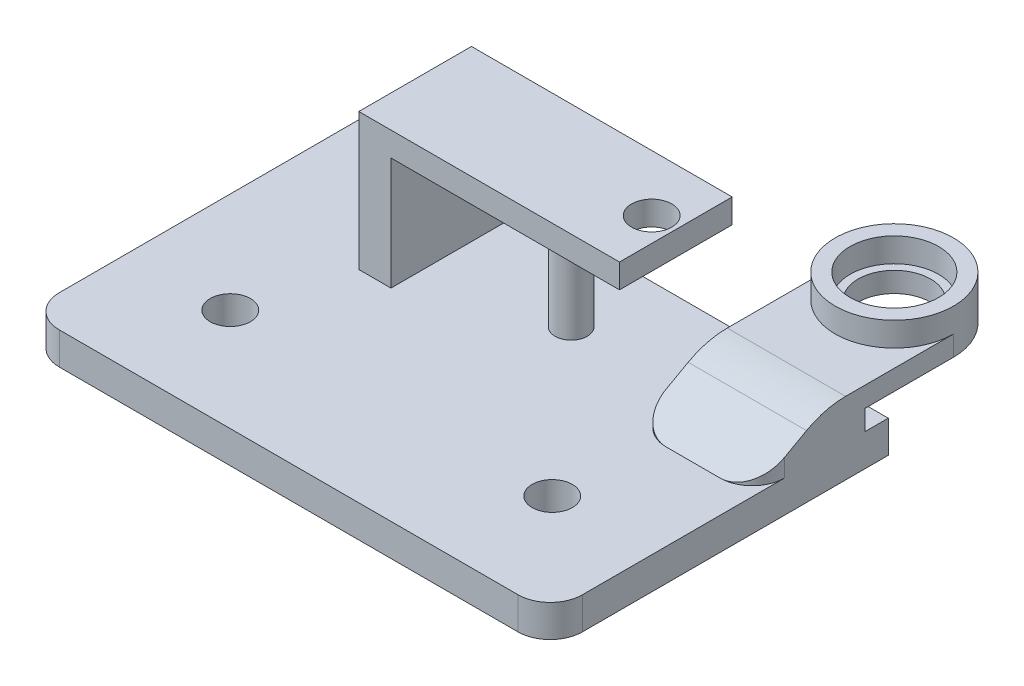
ISO-10303-21;
HEADER;
FILE_DESCRIPTION(('STEP AP214'),'2;1');
FILE_NAME('part.step','',(''),(''),'','','');
FILE_SCHEMA(('AUTOMOTIVE_DESIGN { 1 0 10303 214 1 1 1 1 }'));
ENDSEC;
DATA;
#1=APPLICATION_CONTEXT('core data for automotive mechanical design processes');
#2=APPLICATION_PROTOCOL_DEFINITION('international standard','automotive_design',2000,#1);
#3=PRODUCT_CONTEXT('',#1,'mechanical');
#4=PRODUCT('Part','Part','',(#3));
#5=PRODUCT_RELATED_PRODUCT_CATEGORY('part','',(#4));
#6=PRODUCT_DEFINITION_FORMATION('','',#4);
#7=PRODUCT_DEFINITION_CONTEXT('part definition',#1,'design');
#8=PRODUCT_DEFINITION('design','',#6,#7);
#9=PRODUCT_DEFINITION_SHAPE('','',#8);
#10=(LENGTH_UNIT() NAMED_UNIT(*) SI_UNIT(.MILLI.,.METRE.));
#11=(NAMED_UNIT(*) PLANE_ANGLE_UNIT() SI_UNIT($,.RADIAN.));
#12=(NAMED_UNIT(*) SI_UNIT($,.STERADIAN.) SOLID_ANGLE_UNIT());
#13=UNCERTAINTY_MEASURE_WITH_UNIT(LENGTH_MEASURE(1.E-05),#10,'distance_accuracy_value','');
#14=(GEOMETRIC_REPRESENTATION_CONTEXT(3) GLOBAL_UNCERTAINTY_ASSIGNED_CONTEXT((#13)) GLOBAL_UNIT_ASSIGNED_CONTEXT((#10,
#11,#12)) REPRESENTATION_CONTEXT('',''));
#15=CARTESIAN_POINT('',(0.,0.,0.));
#16=DIRECTION('',(0.,0.,1.));
#17=DIRECTION('',(1.,0.,0.));
#18=AXIS2_PLACEMENT_3D('',#15,#16,#17);
#19=CARTESIAN_POINT('',(45.4999999999992,9.,-32.1043329903239));
#20=DIRECTION('',(0.,1.,0.));
#21=DIRECTION('',(0.,0.,1.));
#22=AXIS2_PLACEMENT_3D('',#19,#20,#21);
#23=PLANE('',#22);
#24=CARTESIAN_POINT('',(57.6499999999992,9.,-50.1043329903239));
#25=DIRECTION('',(0.,1.,0.));
#26=DIRECTION('',(0.,0.,1.));
#27=AXIS2_PLACEMENT_3D('',#24,#25,#26);
#28=CIRCLE('',#27,4.5);
#29=CARTESIAN_POINT('',(57.6499999999992,9.,-45.6043329903239));
#30=VERTEX_POINT('',#29);
#31=EDGE_CURVE('E253',#30,#30,#28,.T.);
#32=ORIENTED_EDGE('',*,*,#31,.F.);
#33=EDGE_LOOP('',(#32));
#34=FACE_BOUND('',#33,.T.);
#35=CARTESIAN_POINT('',(57.6499999999992,9.,-50.1043329903239));
#36=DIRECTION('',(0.,1.,0.));
#37=DIRECTION('',(0.,0.,1.));
#38=AXIS2_PLACEMENT_3D('',#35,#36,#37);
#39=CIRCLE('',#38,5.5);
#40=CARTESIAN_POINT('',(57.6499999999992,9.,-44.6043329903239));
#41=VERTEX_POINT('',#40);
#42=EDGE_CURVE('E12',#41,#41,#39,.F.);
#43=ORIENTED_EDGE('',*,*,#42,.F.);
#44=EDGE_LOOP('',(#43));
#45=FACE_BOUND('',#44,.T.);
#46=ADVANCED_FACE('F55',(#34,#45),#23,.T.);
#47=CARTESIAN_POINT('',(20.1111633715986,35.560219778561,-25.1043329903239));
#48=DIRECTION('',(-1.,0.,0.));
#49=DIRECTION('',(0.,0.,1.));
#50=AXIS2_PLACEMENT_3D('',#47,#48,#49);
#51=PLANE('',#50);
#52=DIRECTION('',(0.,-1.,0.));
#53=VECTOR('',#52,1.);
#54=CARTESIAN_POINT('',(20.1111633715986,18.,-30.6043329903239));
#55=LINE('',#54,#53);
#56=CARTESIAN_POINT('',(20.1111633715986,18.,-30.6043329903239));
#57=VERTEX_POINT('',#56);
#58=CARTESIAN_POINT('',(20.1111633715986,14.,-30.6043329903239));
#59=VERTEX_POINT('',#58);
#60=EDGE_CURVE('E258',#57,#59,#55,.T.);
#61=ORIENTED_EDGE('',*,*,#60,.F.);
#62=DIRECTION('',(0.,0.,-1.));
#63=VECTOR('',#62,1.);
#64=CARTESIAN_POINT('',(20.1111633715986,18.,-25.1043329903239));
#65=LINE('',#64,#63);
#66=CARTESIAN_POINT('',(20.1111633715986,18.,-25.1043329903239));
#67=VERTEX_POINT('',#66);
#68=EDGE_CURVE('E341',#67,#57,#65,.T.);
#69=ORIENTED_EDGE('',*,*,#68,.F.);
#70=DIRECTION('',(0.,-1.,0.));
#71=VECTOR('',#70,1.);
#72=CARTESIAN_POINT('',(20.1111633715986,35.560219778561,-25.1043329903239));
#73=LINE('',#72,#71);
#74=CARTESIAN_POINT('',(20.1111633715986,4.,-25.1043329903239));
#75=VERTEX_POINT('',#74);
#76=EDGE_CURVE('E359',#67,#75,#73,.T.);
#77=ORIENTED_EDGE('',*,*,#76,.T.);
#78=DIRECTION('',(0.,0.,-1.));
#79=VECTOR('',#78,1.);
#80=CARTESIAN_POINT('',(20.1111633715986,4.,-25.1043329903239));
#81=LINE('',#80,#79);
#82=CARTESIAN_POINT('',(20.1111633715986,4.,-39.1043329903239));
#83=VERTEX_POINT('',#82);
#84=EDGE_CURVE('E356',#75,#83,#81,.T.);
#85=ORIENTED_EDGE('',*,*,#84,.T.);
#86=DIRECTION('',(0.,-1.,0.));
#87=VECTOR('',#86,1.);
#88=CARTESIAN_POINT('',(20.1111633715986,35.560219778561,-39.1043329903239));
#89=LINE('',#88,#87);
#90=CARTESIAN_POINT('',(20.1111633715986,18.,-39.1043329903239));
#91=VERTEX_POINT('',#90);
#92=EDGE_CURVE('E355',#91,#83,#89,.T.);
#93=ORIENTED_EDGE('',*,*,#92,.F.);
#94=CARTESIAN_POINT('',(20.1111633715986,18.,-33.6043329903239));
#95=VERTEX_POINT('',#94);
#96=EDGE_CURVE('E345',#95,#91,#65,.T.);
#97=ORIENTED_EDGE('',*,*,#96,.F.);
#98=DIRECTION('',(0.,-1.,0.));
#99=VECTOR('',#98,1.);
#100=CARTESIAN_POINT('',(20.1111633715986,18.,-33.6043329903239));
#101=LINE('',#100,#99);
#102=CARTESIAN_POINT('',(20.1111633715986,14.,-33.6043329903239));
#103=VERTEX_POINT('',#102);
#104=EDGE_CURVE('E70',#95,#103,#101,.T.);
#105=ORIENTED_EDGE('',*,*,#104,.T.);
#106=DIRECTION('',(0.,0.,-1.));
#107=VECTOR('',#106,1.);
#108=CARTESIAN_POINT('',(20.1111633715986,14.,-30.6043329903239));
#109=LINE('',#108,#107);
#110=EDGE_CURVE('E273',#59,#103,#109,.T.);
#111=ORIENTED_EDGE('',*,*,#110,.F.);
#112=EDGE_LOOP('',(#61,#69,#77,#85,#93,#97,#105,#111));
#113=FACE_BOUND('',#112,.T.);
#114=ADVANCED_FACE('F515',(#113),#51,.F.);
#115=CARTESIAN_POINT('',(71.8178210632764,18.,-25.1043329903239));
#116=DIRECTION('',(0.,1.,0.));
#117=DIRECTION('',(0.,0.,1.));
#118=AXIS2_PLACEMENT_3D('',#115,#116,#117);
#119=PLANE('',#118);
#120=CARTESIAN_POINT('',(35.4999999999992,18.,-32.1043329903239));
#121=DIRECTION('',(0.,1.,0.));
#122=DIRECTION('',(0.,0.,1.));
#123=AXIS2_PLACEMENT_3D('',#120,#121,#122);
#124=CIRCLE('',#123,2.);
#125=CARTESIAN_POINT('',(35.4999999999992,18.,-30.1043329903239));
#126=VERTEX_POINT('',#125);
#127=EDGE_CURVE('E250',#126,#126,#124,.T.);
#128=ORIENTED_EDGE('',*,*,#127,.T.);
#129=EDGE_LOOP('',(#128));
#130=FACE_BOUND('',#129,.T.);
#131=CARTESIAN_POINT('',(45.4999999999992,18.,-32.1043329903239));
#132=DIRECTION('',(0.,1.,0.));
#133=DIRECTION('',(0.,0.,1.));
#134=AXIS2_PLACEMENT_3D('',#131,#132,#133);
#135=CIRCLE('',#134,2.50000000000001);
#136=CARTESIAN_POINT('',(45.4999999999992,18.,-29.6043329903239));
#137=VERTEX_POINT('',#136);
#138=EDGE_CURVE('E340',#137,#137,#135,.F.);
#139=ORIENTED_EDGE('',*,*,#138,.F.);
#140=EDGE_LOOP('',(#139));
#141=FACE_BOUND('',#140,.T.);
#142=DIRECTION('',(-1.,0.,0.));
#143=VECTOR('',#142,1.);
#144=CARTESIAN_POINT('',(24.1111633715986,18.,-30.6043329903239));
#145=LINE('',#144,#143);
#146=CARTESIAN_POINT('',(24.1111633715986,18.,-30.6043329903239));
#147=VERTEX_POINT('',#146);
#148=EDGE_CURVE('E264',#147,#57,#145,.T.);
#149=ORIENTED_EDGE('',*,*,#148,.F.);
#150=DIRECTION('',(0.,0.,-1.));
#151=VECTOR('',#150,1.);
#152=CARTESIAN_POINT('',(24.1111633715986,18.,-30.6043329903239));
#153=LINE('',#152,#151);
#154=CARTESIAN_POINT('',(24.1111633715986,18.,-33.6043329903239));
#155=VERTEX_POINT('',#154);
#156=EDGE_CURVE('E266',#147,#155,#153,.T.);
#157=ORIENTED_EDGE('',*,*,#156,.T.);
#158=DIRECTION('',(-1.,0.,0.));
#159=VECTOR('',#158,1.);
#160=CARTESIAN_POINT('',(24.1111633715986,18.,-33.6043329903239));
#161=LINE('',#160,#159);
#162=EDGE_CURVE('E262',#155,#95,#161,.T.);
#163=ORIENTED_EDGE('',*,*,#162,.T.);
#164=ORIENTED_EDGE('',*,*,#96,.T.);
#165=DIRECTION('',(-1.,0.,0.));
#166=VECTOR('',#165,1.);
#167=CARTESIAN_POINT('',(71.8178210632764,18.,-39.1043329903239));
#168=LINE('',#167,#166);
#169=CARTESIAN_POINT('',(48.4999999999992,18.,-39.1043329903239));
#170=VERTEX_POINT('',#169);
#171=EDGE_CURVE('E344',#170,#91,#168,.T.);
#172=ORIENTED_EDGE('',*,*,#171,.F.);
#173=DIRECTION('',(0.,0.,-1.));
#174=VECTOR('',#173,1.);
#175=CARTESIAN_POINT('',(48.4999999999992,18.,-25.1043329903239));
#176=LINE('',#175,#174);
#177=CARTESIAN_POINT('',(48.4999999999992,18.,-25.1043329903239));
#178=VERTEX_POINT('',#177);
#179=EDGE_CURVE('E277',#178,#170,#176,.T.);
#180=ORIENTED_EDGE('',*,*,#179,.F.);
#181=DIRECTION('',(-1.,0.,0.));
#182=VECTOR('',#181,1.);
#183=CARTESIAN_POINT('',(71.8178210632764,18.,-25.1043329903239));
#184=LINE('',#183,#182);
#185=EDGE_CURVE('E346',#178,#67,#184,.T.);
#186=ORIENTED_EDGE('',*,*,#185,.T.);
#187=ORIENTED_EDGE('',*,*,#68,.T.);
#188=EDGE_LOOP('',(#149,#157,#163,#164,#172,#180,#186,#187));
#189=FACE_BOUND('',#188,.T.);
#190=ADVANCED_FACE('F442',(#130,#141,#189),#119,.F.);
#191=CARTESIAN_POINT('',(4.,4.,-4.));
#192=DIRECTION('',(0.,1.,0.));
#193=DIRECTION('',(0.,0.,1.));
#194=AXIS2_PLACEMENT_3D('',#191,#192,#193);
#195=PLANE('',#194);
#196=CARTESIAN_POINT('',(35.4999999999992,4.,-32.1043329903239));
#197=DIRECTION('',(0.,1.,0.));
#198=DIRECTION('',(0.,0.,1.));
#199=AXIS2_PLACEMENT_3D('',#196,#197,#198);
#200=CIRCLE('',#199,2.);
#201=CARTESIAN_POINT('',(35.4999999999992,4.,-30.1043329903239));
#202=VERTEX_POINT('',#201);
#203=EDGE_CURVE('E63',#202,#202,#200,.T.);
#204=ORIENTED_EDGE('',*,*,#203,.F.);
#205=EDGE_LOOP('',(#204));
#206=FACE_BOUND('',#205,.T.);
#207=DIRECTION('',(1.,0.,0.));
#208=VECTOR('',#207,1.);
#209=CARTESIAN_POINT('',(16.1111633715986,4.,-25.1043329903239));
#210=LINE('',#209,#208);
#211=CARTESIAN_POINT('',(16.1111633715986,4.,-25.1043329903239));
#212=VERTEX_POINT('',#211);
#213=EDGE_CURVE('E360',#212,#75,#210,.T.);
#214=ORIENTED_EDGE('',*,*,#213,.F.);
#215=DIRECTION('',(0.,0.,1.));
#216=VECTOR('',#215,1.);
#217=CARTESIAN_POINT('',(16.1111633715986,4.,-25.1043329903239));
#218=LINE('',#217,#216);
#219=CARTESIAN_POINT('',(16.1111633715986,4.,-39.1043329903239));
#220=VERTEX_POINT('',#219);
#221=EDGE_CURVE('E364',#220,#212,#218,.T.);
#222=ORIENTED_EDGE('',*,*,#221,.F.);
#223=DIRECTION('',(-1.,0.,0.));
#224=VECTOR('',#223,1.);
#225=CARTESIAN_POINT('',(16.1111633715986,4.,-39.1043329903239));
#226=LINE('',#225,#224);
#227=EDGE_CURVE('E351',#83,#220,#226,.T.);
#228=ORIENTED_EDGE('',*,*,#227,.F.);
#229=ORIENTED_EDGE('',*,*,#84,.F.);
#230=EDGE_LOOP('',(#214,#222,#228,#229));
#231=FACE_BOUND('',#230,.T.);
#232=CARTESIAN_POINT('',(52.5,4.,-12.75));
#233=DIRECTION('',(0.,1.,0.));
#234=DIRECTION('',(0.,0.,1.));
#235=AXIS2_PLACEMENT_3D('',#232,#233,#234);
#236=CIRCLE('',#235,2.5);
#237=CARTESIAN_POINT('',(52.5,4.,-10.25));
#238=VERTEX_POINT('',#237);
#239=EDGE_CURVE('E379',#238,#238,#236,.T.);
#240=ORIENTED_EDGE('',*,*,#239,.F.);
#241=EDGE_LOOP('',(#240));
#242=FACE_BOUND('',#241,.T.);
#243=CARTESIAN_POINT('',(12.5,4.,-12.75));
#244=DIRECTION('',(0.,1.,0.));
#245=DIRECTION('',(0.,0.,1.));
#246=AXIS2_PLACEMENT_3D('',#243,#244,#245);
#247=CIRCLE('',#246,2.5);
#248=CARTESIAN_POINT('',(12.5,4.,-10.25));
#249=VERTEX_POINT('',#248);
#250=EDGE_CURVE('E385',#249,#249,#247,.T.);
#251=ORIENTED_EDGE('',*,*,#250,.F.);
#252=EDGE_LOOP('',(#251));
#253=FACE_BOUND('',#252,.T.);
#254=DIRECTION('',(0.,0.,-1.));
#255=VECTOR('',#254,1.);
#256=CARTESIAN_POINT('',(65.,4.,-4.00000000000003));
#257=LINE('',#256,#255);
#258=CARTESIAN_POINT('',(65.,4.,-39.1043329903239));
#259=VERTEX_POINT('',#258);
#260=CARTESIAN_POINT('',(65.,4.,-42.));
#261=VERTEX_POINT('',#260);
#262=EDGE_CURVE('E394',#259,#261,#257,.T.);
#263=ORIENTED_EDGE('',*,*,#262,.T.);
#264=DIRECTION('',(-1.,0.,0.));
#265=VECTOR('',#264,1.);
#266=CARTESIAN_POINT('',(4.,4.,-42.));
#267=LINE('',#266,#265);
#268=CARTESIAN_POINT('',(0.,4.,-42.));
#269=VERTEX_POINT('',#268);
#270=EDGE_CURVE('E287',#261,#269,#267,.T.);
#271=ORIENTED_EDGE('',*,*,#270,.T.);
#272=DIRECTION('',(0.,0.,1.));
#273=VECTOR('',#272,1.);
#274=CARTESIAN_POINT('',(0.,4.,-4.00000000000003));
#275=LINE('',#274,#273);
#276=CARTESIAN_POINT('',(0.,4.,-4.00000000000003));
#277=VERTEX_POINT('',#276);
#278=EDGE_CURVE('E393',#269,#277,#275,.T.);
#279=ORIENTED_EDGE('',*,*,#278,.T.);
#280=CARTESIAN_POINT('',(4.,4.,-4.));
#281=DIRECTION('',(0.,1.,0.));
#282=DIRECTION('',(0.,0.,1.));
#283=AXIS2_PLACEMENT_3D('',#280,#281,#282);
#284=CIRCLE('',#283,4.);
#285=CARTESIAN_POINT('',(4.,4.,0.));
#286=VERTEX_POINT('',#285);
#287=EDGE_CURVE('E396',#277,#286,#284,.T.);
#288=ORIENTED_EDGE('',*,*,#287,.T.);
#289=DIRECTION('',(1.,0.,0.));
#290=VECTOR('',#289,1.);
#291=CARTESIAN_POINT('',(4.00000000000003,4.,0.));
#292=LINE('',#291,#290);
#293=CARTESIAN_POINT('',(61.,4.,0.));
#294=VERTEX_POINT('',#293);
#295=EDGE_CURVE('E398',#286,#294,#292,.T.);
#296=ORIENTED_EDGE('',*,*,#295,.T.);
#297=CARTESIAN_POINT('',(61.,4.,-4.));
#298=DIRECTION('',(0.,1.,0.));
#299=DIRECTION('',(0.,0.,-1.));
#300=AXIS2_PLACEMENT_3D('',#297,#298,#299);
#301=CIRCLE('',#300,4.);
#302=CARTESIAN_POINT('',(65.,4.,-4.00000000000003));
#303=VERTEX_POINT('',#302);
#304=EDGE_CURVE('E400',#294,#303,#301,.T.);
#305=ORIENTED_EDGE('',*,*,#304,.T.);
#306=CARTESIAN_POINT('',(65.,4.,-29.104332990324));
#307=VERTEX_POINT('',#306);
#308=EDGE_CURVE('E391',#303,#307,#257,.T.);
#309=ORIENTED_EDGE('',*,*,#308,.T.);
#310=CARTESIAN_POINT('',(61.,4.,-29.1043329903239));
#311=DIRECTION('',(0.,1.,0.));
#312=DIRECTION('',(0.,0.,1.));
#313=AXIS2_PLACEMENT_3D('',#310,#311,#312);
#314=CIRCLE('',#313,4.);
#315=CARTESIAN_POINT('',(61.,4.,-25.1043329903239));
#316=VERTEX_POINT('',#315);
#317=EDGE_CURVE('E318',#316,#307,#314,.T.);
#318=ORIENTED_EDGE('',*,*,#317,.F.);
#319=DIRECTION('',(1.,0.,0.));
#320=VECTOR('',#319,1.);
#321=CARTESIAN_POINT('',(61.,4.,-25.1043329903239));
#322=LINE('',#321,#320);
#323=CARTESIAN_POINT('',(54.3,4.,-25.1043329903239));
#324=VERTEX_POINT('',#323);
#325=EDGE_CURVE('E322',#324,#316,#322,.T.);
#326=ORIENTED_EDGE('',*,*,#325,.F.);
#327=CARTESIAN_POINT('',(54.3,4.,-29.1043329903239));
#328=DIRECTION('',(0.,1.,0.));
#329=DIRECTION('',(0.,0.,-1.));
#330=AXIS2_PLACEMENT_3D('',#327,#328,#329);
#331=CIRCLE('',#330,4.);
#332=CARTESIAN_POINT('',(50.3,4.,-29.1043329903239));
#333=VERTEX_POINT('',#332);
#334=EDGE_CURVE('E324',#333,#324,#331,.T.);
#335=ORIENTED_EDGE('',*,*,#334,.F.);
#336=DIRECTION('',(0.,0.,1.));
#337=VECTOR('',#336,1.);
#338=CARTESIAN_POINT('',(50.3,4.,-29.1043329903239));
#339=LINE('',#338,#337);
#340=CARTESIAN_POINT('',(50.3,4.,-39.1043329903239));
#341=VERTEX_POINT('',#340);
#342=EDGE_CURVE('E328',#341,#333,#339,.T.);
#343=ORIENTED_EDGE('',*,*,#342,.F.);
#344=DIRECTION('',(-1.,0.,0.));
#345=VECTOR('',#344,1.);
#346=CARTESIAN_POINT('',(65.,4.,-39.1043329903239));
#347=LINE('',#346,#345);
#348=EDGE_CURVE('E241',#259,#341,#347,.T.);
#349=ORIENTED_EDGE('',*,*,#348,.F.);
#350=EDGE_LOOP('',(#263,#271,#279,#288,#296,#305,#309,#318,#326,#335,#343,#349));
#351=FACE_BOUND('',#350,.T.);
#352=ADVANCED_FACE('F438',(#206,#231,#242,#253,#351),#195,.T.);
#353=CARTESIAN_POINT('',(65.,4.,-4.00000000000003));
#354=DIRECTION('',(-1.,0.,0.));
#355=DIRECTION('',(0.,0.,1.));
#356=AXIS2_PLACEMENT_3D('',#353,#354,#355);
#357=PLANE('',#356);
#358=DIRECTION('',(0.,1.,0.));
#359=VECTOR('',#358,1.);
#360=CARTESIAN_POINT('',(65.,0.,-42.));
#361=LINE('',#360,#359);
#362=CARTESIAN_POINT('',(65.,0.,-42.));
#363=VERTEX_POINT('',#362);
#364=EDGE_CURVE('E279',#363,#261,#361,.T.);
#365=ORIENTED_EDGE('',*,*,#364,.T.);
#366=ORIENTED_EDGE('',*,*,#262,.F.);
#367=DIRECTION('',(0.,-1.,0.));
#368=VECTOR('',#367,1.);
#369=CARTESIAN_POINT('',(65.,29.3,-39.1043329903239));
#370=LINE('',#369,#368);
#371=CARTESIAN_POINT('',(65.,6.50000000000001,-39.1043329903239));
#372=VERTEX_POINT('',#371);
#373=EDGE_CURVE('E317',#372,#259,#370,.T.);
#374=ORIENTED_EDGE('',*,*,#373,.F.);
#375=DIRECTION('',(0.,0.,-1.));
#376=VECTOR('',#375,1.);
#377=CARTESIAN_POINT('',(65.,6.50000000000001,0.));
#378=LINE('',#377,#376);
#379=CARTESIAN_POINT('',(65.,6.50000000000001,-50.1043329903239));
#380=VERTEX_POINT('',#379);
#381=EDGE_CURVE('E229',#372,#380,#378,.T.);
#382=ORIENTED_EDGE('',*,*,#381,.T.);
#383=DIRECTION('',(0.,1.,0.));
#384=VECTOR('',#383,1.);
#385=CARTESIAN_POINT('',(65.,6.50000000000001,-50.1043329903239));
#386=LINE('',#385,#384);
#387=CARTESIAN_POINT('',(65.,9.,-50.1043329903239));
#388=VERTEX_POINT('',#387);
#389=EDGE_CURVE('E228',#380,#388,#386,.T.);
#390=ORIENTED_EDGE('',*,*,#389,.T.);
#391=DIRECTION('',(0.,0.,-1.));
#392=VECTOR('',#391,1.);
#393=CARTESIAN_POINT('',(65.,9.,-29.104332990324));
#394=LINE('',#393,#392);
#395=CARTESIAN_POINT('',(65.,9.,-36.6955932722979));
#396=VERTEX_POINT('',#395);
#397=EDGE_CURVE('E240',#396,#388,#394,.T.);
#398=ORIENTED_EDGE('',*,*,#397,.F.);
#399=CARTESIAN_POINT('',(65.,-0.999999999999999,-36.6955932722979));
#400=DIRECTION('',(-1.,0.,0.));
#401=DIRECTION('',(0.,0.,1.));
#402=AXIS2_PLACEMENT_3D('',#399,#400,#401);
#403=CIRCLE('',#402,10.);
#404=CARTESIAN_POINT('',(65.,7.74157276121538,-31.8391639605116));
#405=VERTEX_POINT('',#404);
#406=EDGE_CURVE('E428',#396,#405,#403,.F.);
#407=ORIENTED_EDGE('',*,*,#406,.T.);
#408=DIRECTION('',(0.,0.485642931178632,-0.874157276121538));
#409=VECTOR('',#408,1.);
#410=CARTESIAN_POINT('',(65.,-7.60089608079789,-4.22272004488771));
#411=LINE('',#410,#409);
#412=CARTESIAN_POINT('',(65.,6.22222222222223,-29.1043329903239));
#413=VERTEX_POINT('',#412);
#414=EDGE_CURVE('E302',#413,#405,#411,.T.);
#415=ORIENTED_EDGE('',*,*,#414,.F.);
#416=DIRECTION('',(0.,-1.,0.));
#417=VECTOR('',#416,1.);
#418=CARTESIAN_POINT('',(65.,29.3,-29.104332990324));
#419=LINE('',#418,#417);
#420=EDGE_CURVE('E321',#413,#307,#419,.T.);
#421=ORIENTED_EDGE('',*,*,#420,.T.);
#422=ORIENTED_EDGE('',*,*,#308,.F.);
#423=DIRECTION('',(0.,-1.,0.));
#424=VECTOR('',#423,1.);
#425=CARTESIAN_POINT('',(65.,4.,-4.00000000000003));
#426=LINE('',#425,#424);
#427=CARTESIAN_POINT('',(65.,0.,-4.00000000000003));
#428=VERTEX_POINT('',#427);
#429=EDGE_CURVE('E402',#303,#428,#426,.T.);
#430=ORIENTED_EDGE('',*,*,#429,.T.);
#431=DIRECTION('',(0.,0.,-1.));
#432=VECTOR('',#431,1.);
#433=CARTESIAN_POINT('',(65.,0.,-4.00000000000003));
#434=LINE('',#433,#432);
#435=EDGE_CURVE('E388',#428,#363,#434,.T.);
#436=ORIENTED_EDGE('',*,*,#435,.T.);
#437=EDGE_LOOP('',(#365,#366,#374,#382,#390,#398,#407,#415,#421,#422,#430,#436));
#438=FACE_BOUND('',#437,.T.);
#439=ADVANCED_FACE('F441',(#438),#357,.F.);
#440=CARTESIAN_POINT('',(0.,4.,-4.00000000000003));
#441=DIRECTION('',(1.,0.,0.));
#442=DIRECTION('',(0.,0.,-1.));
#443=AXIS2_PLACEMENT_3D('',#440,#441,#442);
#444=PLANE('',#443);
#445=DIRECTION('',(0.,-1.,0.));
#446=VECTOR('',#445,1.);
#447=CARTESIAN_POINT('',(0.,0.,-42.));
#448=LINE('',#447,#446);
#449=CARTESIAN_POINT('',(0.,0.,-42.));
#450=VERTEX_POINT('',#449);
#451=EDGE_CURVE('E284',#269,#450,#448,.T.);
#452=ORIENTED_EDGE('',*,*,#451,.T.);
#453=DIRECTION('',(0.,0.,1.));
#454=VECTOR('',#453,1.);
#455=CARTESIAN_POINT('',(0.,0.,-4.00000000000003));
#456=LINE('',#455,#454);
#457=CARTESIAN_POINT('',(0.,0.,-4.00000000000003));
#458=VERTEX_POINT('',#457);
#459=EDGE_CURVE('E405',#450,#458,#456,.T.);
#460=ORIENTED_EDGE('',*,*,#459,.T.);
#461=DIRECTION('',(0.,-1.,0.));
#462=VECTOR('',#461,1.);
#463=CARTESIAN_POINT('',(0.,4.,-4.00000000000003));
#464=LINE('',#463,#462);
#465=EDGE_CURVE('E421',#277,#458,#464,.T.);
#466=ORIENTED_EDGE('',*,*,#465,.F.);
#467=ORIENTED_EDGE('',*,*,#278,.F.);
#468=EDGE_LOOP('',(#452,#460,#466,#467));
#469=FACE_BOUND('',#468,.T.);
#470=ADVANCED_FACE('F470',(#469),#444,.F.);
#471=CARTESIAN_POINT('',(4.,0.,-4.));
#472=DIRECTION('',(0.,1.,0.));
#473=DIRECTION('',(0.,0.,1.));
#474=AXIS2_PLACEMENT_3D('',#471,#472,#473);
#475=PLANE('',#474);
#476=CARTESIAN_POINT('',(52.5,0.,-12.75));
#477=DIRECTION('',(0.,1.,0.));
#478=DIRECTION('',(0.,0.,1.));
#479=AXIS2_PLACEMENT_3D('',#476,#477,#478);
#480=CIRCLE('',#479,2.5);
#481=CARTESIAN_POINT('',(52.5,0.,-10.25));
#482=VERTEX_POINT('',#481);
#483=EDGE_CURVE('E370',#482,#482,#480,.T.);
#484=ORIENTED_EDGE('',*,*,#483,.T.);
#485=EDGE_LOOP('',(#484));
#486=FACE_BOUND('',#485,.T.);
#487=CARTESIAN_POINT('',(12.5,0.,-12.75));
#488=DIRECTION('',(0.,1.,0.));
#489=DIRECTION('',(0.,0.,1.));
#490=AXIS2_PLACEMENT_3D('',#487,#488,#489);
#491=CIRCLE('',#490,2.5);
#492=CARTESIAN_POINT('',(12.5,0.,-10.25));
#493=VERTEX_POINT('',#492);
#494=EDGE_CURVE('E382',#493,#493,#491,.T.);
#495=ORIENTED_EDGE('',*,*,#494,.T.);
#496=EDGE_LOOP('',(#495));
#497=FACE_BOUND('',#496,.T.);
#498=DIRECTION('',(1.,0.,0.));
#499=VECTOR('',#498,1.);
#500=CARTESIAN_POINT('',(-21.0297408448131,0.,-42.));
#501=LINE('',#500,#499);
#502=EDGE_CURVE('E288',#450,#363,#501,.T.);
#503=ORIENTED_EDGE('',*,*,#502,.T.);
#504=ORIENTED_EDGE('',*,*,#435,.F.);
#505=CARTESIAN_POINT('',(61.,0.,-4.));
#506=DIRECTION('',(0.,1.,0.));
#507=DIRECTION('',(0.,0.,-1.));
#508=AXIS2_PLACEMENT_3D('',#505,#506,#507);
#509=CIRCLE('',#508,4.);
#510=CARTESIAN_POINT('',(61.,0.,0.));
#511=VERTEX_POINT('',#510);
#512=EDGE_CURVE('E411',#511,#428,#509,.T.);
#513=ORIENTED_EDGE('',*,*,#512,.F.);
#514=DIRECTION('',(1.,0.,0.));
#515=VECTOR('',#514,1.);
#516=CARTESIAN_POINT('',(4.00000000000003,0.,0.));
#517=LINE('',#516,#515);
#518=CARTESIAN_POINT('',(4.,0.,0.));
#519=VERTEX_POINT('',#518);
#520=EDGE_CURVE('E409',#519,#511,#517,.T.);
#521=ORIENTED_EDGE('',*,*,#520,.F.);
#522=CARTESIAN_POINT('',(4.,0.,-4.));
#523=DIRECTION('',(0.,1.,0.));
#524=DIRECTION('',(0.,0.,1.));
#525=AXIS2_PLACEMENT_3D('',#522,#523,#524);
#526=CIRCLE('',#525,4.);
#527=EDGE_CURVE('E407',#458,#519,#526,.T.);
#528=ORIENTED_EDGE('',*,*,#527,.F.);
#529=ORIENTED_EDGE('',*,*,#459,.F.);
#530=EDGE_LOOP('',(#503,#504,#513,#521,#528,#529));
#531=FACE_BOUND('',#530,.T.);
#532=ADVANCED_FACE('F464',(#486,#497,#531),#475,.F.);
#533=CARTESIAN_POINT('',(65.,29.3,-39.1043329903239));
#534=DIRECTION('',(0.,0.,1.));
#535=DIRECTION('',(1.,0.,0.));
#536=AXIS2_PLACEMENT_3D('',#533,#534,#535);
#537=PLANE('',#536);
#538=DIRECTION('',(1.,0.,0.));
#539=VECTOR('',#538,1.);
#540=CARTESIAN_POINT('',(0.,6.50000000000001,-39.1043329903239));
#541=LINE('',#540,#539);
#542=CARTESIAN_POINT('',(50.2999999999983,6.50000000000001,-39.1043329903239));
#543=VERTEX_POINT('',#542);
#544=EDGE_CURVE('E298',#543,#372,#541,.T.);
#545=ORIENTED_EDGE('',*,*,#544,.T.);
#546=ORIENTED_EDGE('',*,*,#373,.T.);
#547=ORIENTED_EDGE('',*,*,#348,.T.);
#548=DIRECTION('',(0.,-1.,0.));
#549=VECTOR('',#548,1.);
#550=CARTESIAN_POINT('',(50.3,29.3,-39.1043329903239));
#551=LINE('',#550,#549);
#552=EDGE_CURVE('E314',#543,#341,#551,.T.);
#553=ORIENTED_EDGE('',*,*,#552,.F.);
#554=EDGE_LOOP('',(#545,#546,#547,#553));
#555=FACE_BOUND('',#554,.T.);
#556=ADVANCED_FACE('F500',(#555),#537,.F.);
#557=CARTESIAN_POINT('',(4.,4.,-4.));
#558=DIRECTION('',(0.,-1.,0.));
#559=DIRECTION('',(0.,0.,-1.));
#560=AXIS2_PLACEMENT_3D('',#557,#558,#559);
#561=CYLINDRICAL_SURFACE('',#560,4.);
#562=ORIENTED_EDGE('',*,*,#527,.T.);
#563=DIRECTION('',(0.,-1.,0.));
#564=VECTOR('',#563,1.);
#565=CARTESIAN_POINT('',(4.,4.,0.));
#566=LINE('',#565,#564);
#567=EDGE_CURVE('E418',#286,#519,#566,.T.);
#568=ORIENTED_EDGE('',*,*,#567,.F.);
#569=ORIENTED_EDGE('',*,*,#287,.F.);
#570=ORIENTED_EDGE('',*,*,#465,.T.);
#571=EDGE_LOOP('',(#562,#568,#569,#570));
#572=FACE_BOUND('',#571,.T.);
#573=ADVANCED_FACE('F473',(#572),#561,.T.);
#574=CARTESIAN_POINT('',(4.00000000000003,4.,0.));
#575=DIRECTION('',(0.,0.,-1.));
#576=DIRECTION('',(-1.,0.,0.));
#577=AXIS2_PLACEMENT_3D('',#574,#575,#576);
#578=PLANE('',#577);
#579=DIRECTION('',(0.,-1.,0.));
#580=VECTOR('',#579,1.);
#581=CARTESIAN_POINT('',(61.,4.,0.));
#582=LINE('',#581,#580);
#583=EDGE_CURVE('E415',#294,#511,#582,.T.);
#584=ORIENTED_EDGE('',*,*,#583,.F.);
#585=ORIENTED_EDGE('',*,*,#295,.F.);
#586=ORIENTED_EDGE('',*,*,#567,.T.);
#587=ORIENTED_EDGE('',*,*,#520,.T.);
#588=EDGE_LOOP('',(#584,#585,#586,#587));
#589=FACE_BOUND('',#588,.T.);
#590=ADVANCED_FACE('F480',(#589),#578,.F.);
#591=CARTESIAN_POINT('',(61.,4.,-4.));
#592=DIRECTION('',(0.,-1.,0.));
#593=DIRECTION('',(0.,0.,-1.));
#594=AXIS2_PLACEMENT_3D('',#591,#592,#593);
#595=CYLINDRICAL_SURFACE('',#594,4.);
#596=ORIENTED_EDGE('',*,*,#512,.T.);
#597=ORIENTED_EDGE('',*,*,#429,.F.);
#598=ORIENTED_EDGE('',*,*,#304,.F.);
#599=ORIENTED_EDGE('',*,*,#583,.T.);
#600=EDGE_LOOP('',(#596,#597,#598,#599));
#601=FACE_BOUND('',#600,.T.);
#602=ADVANCED_FACE('F482',(#601),#595,.T.);
#603=CARTESIAN_POINT('',(12.5,4.,-12.75));
#604=DIRECTION('',(0.,-1.,0.));
#605=DIRECTION('',(0.,0.,-1.));
#606=AXIS2_PLACEMENT_3D('',#603,#604,#605);
#607=CYLINDRICAL_SURFACE('',#606,2.5);
#608=ORIENTED_EDGE('',*,*,#250,.T.);
#609=EDGE_LOOP('',(#608));
#610=FACE_BOUND('',#609,.T.);
#611=ORIENTED_EDGE('',*,*,#494,.F.);
#612=EDGE_LOOP('',(#611));
#613=FACE_BOUND('',#612,.T.);
#614=ADVANCED_FACE('F537',(#610,#613),#607,.F.);
#615=CARTESIAN_POINT('',(52.5,4.,-12.75));
#616=DIRECTION('',(0.,-1.,0.));
#617=DIRECTION('',(0.,0.,-1.));
#618=AXIS2_PLACEMENT_3D('',#615,#616,#617);
#619=CYLINDRICAL_SURFACE('',#618,2.5);
#620=ORIENTED_EDGE('',*,*,#239,.T.);
#621=EDGE_LOOP('',(#620));
#622=FACE_BOUND('',#621,.T.);
#623=ORIENTED_EDGE('',*,*,#483,.F.);
#624=EDGE_LOOP('',(#623));
#625=FACE_BOUND('',#624,.T.);
#626=ADVANCED_FACE('F529',(#622,#625),#619,.F.);
#627=ORIENTED_EDGE('',*,*,#397,.T.);
#628=CARTESIAN_POINT('',(57.6499999999992,9.,-50.1043329903239));
#629=DIRECTION('',(0.,1.,0.));
#630=DIRECTION('',(0.,0.,1.));
#631=AXIS2_PLACEMENT_3D('',#628,#629,#630);
#632=CIRCLE('',#631,7.35000000000085);
#633=CARTESIAN_POINT('',(50.2999999999983,9.,-50.1043329903239));
#634=VERTEX_POINT('',#633);
#635=EDGE_CURVE('E223',#634,#388,#632,.T.);
#636=ORIENTED_EDGE('',*,*,#635,.F.);
#637=DIRECTION('',(0.,0.,1.));
#638=VECTOR('',#637,1.);
#639=CARTESIAN_POINT('',(50.3,9.,-29.1043329903239));
#640=LINE('',#639,#638);
#641=CARTESIAN_POINT('',(50.3,9.,-36.6955932722979));
#642=VERTEX_POINT('',#641);
#643=EDGE_CURVE('E232',#634,#642,#640,.T.);
#644=ORIENTED_EDGE('',*,*,#643,.T.);
#645=DIRECTION('',(1.,0.,0.));
#646=VECTOR('',#645,1.);
#647=CARTESIAN_POINT('',(65.,9.,-36.6955932722979));
#648=LINE('',#647,#646);
#649=EDGE_CURVE('E424',#642,#396,#648,.T.);
#650=ORIENTED_EDGE('',*,*,#649,.T.);
#651=EDGE_LOOP('',(#627,#636,#644,#650));
#652=FACE_BOUND('',#651,.T.);
#653=ADVANCED_FACE('F243',(#652),#23,.T.);
#654=CARTESIAN_POINT('',(16.1111633715986,35.560219778561,-25.1043329903239));
#655=DIRECTION('',(1.,0.,0.));
#656=DIRECTION('',(0.,0.,-1.));
#657=AXIS2_PLACEMENT_3D('',#654,#655,#656);
#658=PLANE('',#657);
#659=DIRECTION('',(0.,0.,1.));
#660=VECTOR('',#659,1.);
#661=CARTESIAN_POINT('',(16.1111633715986,21.,-25.1043329903239));
#662=LINE('',#661,#660);
#663=CARTESIAN_POINT('',(16.1111633715986,21.,-39.1043329903239));
#664=VERTEX_POINT('',#663);
#665=CARTESIAN_POINT('',(16.1111633715986,21.,-25.1043329903239));
#666=VERTEX_POINT('',#665);
#667=EDGE_CURVE('E371',#664,#666,#662,.T.);
#668=ORIENTED_EDGE('',*,*,#667,.F.);
#669=DIRECTION('',(0.,-1.,0.));
#670=VECTOR('',#669,1.);
#671=CARTESIAN_POINT('',(16.1111633715986,35.560219778561,-39.1043329903239));
#672=LINE('',#671,#670);
#673=EDGE_CURVE('E350',#664,#220,#672,.T.);
#674=ORIENTED_EDGE('',*,*,#673,.T.);
#675=ORIENTED_EDGE('',*,*,#221,.T.);
#676=DIRECTION('',(0.,-1.,0.));
#677=VECTOR('',#676,1.);
#678=CARTESIAN_POINT('',(16.1111633715986,35.560219778561,-25.1043329903239));
#679=LINE('',#678,#677);
#680=EDGE_CURVE('E363',#666,#212,#679,.T.);
#681=ORIENTED_EDGE('',*,*,#680,.F.);
#682=EDGE_LOOP('',(#668,#674,#675,#681));
#683=FACE_BOUND('',#682,.T.);
#684=ADVANCED_FACE('F528',(#683),#658,.F.);
#685=CARTESIAN_POINT('',(16.1111633715986,35.560219778561,-25.1043329903239));
#686=DIRECTION('',(0.,0.,-1.));
#687=DIRECTION('',(-1.,0.,0.));
#688=AXIS2_PLACEMENT_3D('',#685,#686,#687);
#689=PLANE('',#688);
#690=ORIENTED_EDGE('',*,*,#185,.F.);
#691=DIRECTION('',(0.,1.,0.));
#692=VECTOR('',#691,1.);
#693=CARTESIAN_POINT('',(48.4999999999992,1.35668302290631,-25.1043329903239));
#694=LINE('',#693,#692);
#695=CARTESIAN_POINT('',(48.4999999999992,21.,-25.1043329903239));
#696=VERTEX_POINT('',#695);
#697=EDGE_CURVE('E78',#178,#696,#694,.T.);
#698=ORIENTED_EDGE('',*,*,#697,.T.);
#699=DIRECTION('',(1.,0.,0.));
#700=VECTOR('',#699,1.);
#701=CARTESIAN_POINT('',(16.1111633715986,21.,-25.1043329903239));
#702=LINE('',#701,#700);
#703=EDGE_CURVE('E367',#666,#696,#702,.T.);
#704=ORIENTED_EDGE('',*,*,#703,.F.);
#705=ORIENTED_EDGE('',*,*,#680,.T.);
#706=ORIENTED_EDGE('',*,*,#213,.T.);
#707=ORIENTED_EDGE('',*,*,#76,.F.);
#708=EDGE_LOOP('',(#690,#698,#704,#705,#706,#707));
#709=FACE_BOUND('',#708,.T.);
#710=ADVANCED_FACE('F534',(#709),#689,.F.);
#711=CARTESIAN_POINT('',(16.1111633715986,35.560219778561,-39.1043329903239));
#712=DIRECTION('',(0.,0.,1.));
#713=DIRECTION('',(1.,0.,0.));
#714=AXIS2_PLACEMENT_3D('',#711,#712,#713);
#715=PLANE('',#714);
#716=DIRECTION('',(-1.,0.,0.));
#717=VECTOR('',#716,1.);
#718=CARTESIAN_POINT('',(16.1111633715986,21.,-39.1043329903239));
#719=LINE('',#718,#717);
#720=CARTESIAN_POINT('',(48.4999999999992,21.,-39.1043329903239));
#721=VERTEX_POINT('',#720);
#722=EDGE_CURVE('E354',#721,#664,#719,.T.);
#723=ORIENTED_EDGE('',*,*,#722,.F.);
#724=DIRECTION('',(0.,1.,0.));
#725=VECTOR('',#724,1.);
#726=CARTESIAN_POINT('',(48.4999999999992,1.35668302290631,-39.1043329903239));
#727=LINE('',#726,#725);
#728=EDGE_CURVE('E280',#170,#721,#727,.T.);
#729=ORIENTED_EDGE('',*,*,#728,.F.);
#730=ORIENTED_EDGE('',*,*,#171,.T.);
#731=ORIENTED_EDGE('',*,*,#92,.T.);
#732=ORIENTED_EDGE('',*,*,#227,.T.);
#733=ORIENTED_EDGE('',*,*,#673,.F.);
#734=EDGE_LOOP('',(#723,#729,#730,#731,#732,#733));
#735=FACE_BOUND('',#734,.T.);
#736=ADVANCED_FACE('F823',(#735),#715,.F.);
#737=CARTESIAN_POINT('',(4.,21.,-4.));
#738=DIRECTION('',(0.,1.,0.));
#739=DIRECTION('',(0.,0.,1.));
#740=AXIS2_PLACEMENT_3D('',#737,#738,#739);
#741=PLANE('',#740);
#742=DIRECTION('',(0.,0.,1.));
#743=VECTOR('',#742,1.);
#744=CARTESIAN_POINT('',(48.4999999999992,21.,-25.1043329903239));
#745=LINE('',#744,#743);
#746=EDGE_CURVE('E276',#721,#696,#745,.T.);
#747=ORIENTED_EDGE('',*,*,#746,.F.);
#748=ORIENTED_EDGE('',*,*,#722,.T.);
#749=ORIENTED_EDGE('',*,*,#667,.T.);
#750=ORIENTED_EDGE('',*,*,#703,.T.);
#751=EDGE_LOOP('',(#747,#748,#749,#750));
#752=FACE_BOUND('',#751,.T.);
#753=CARTESIAN_POINT('',(45.4999999999992,21.,-32.1043329903239));
#754=DIRECTION('',(0.,1.,0.));
#755=DIRECTION('',(0.,0.,1.));
#756=AXIS2_PLACEMENT_3D('',#753,#754,#755);
#757=CIRCLE('',#756,2.50000000000001);
#758=CARTESIAN_POINT('',(45.4999999999992,21.,-29.6043329903239));
#759=VERTEX_POINT('',#758);
#760=EDGE_CURVE('E331',#759,#759,#757,.T.);
#761=ORIENTED_EDGE('',*,*,#760,.F.);
#762=EDGE_LOOP('',(#761));
#763=FACE_BOUND('',#762,.T.);
#764=ADVANCED_FACE('F621',(#752,#763),#741,.T.);
#765=CARTESIAN_POINT('',(45.4999999999992,28.0710678118655,-32.1043329903239));
#766=DIRECTION('',(0.,-1.,0.));
#767=DIRECTION('',(0.,0.,-1.));
#768=AXIS2_PLACEMENT_3D('',#765,#766,#767);
#769=CYLINDRICAL_SURFACE('',#768,2.50000000000001);
#770=ORIENTED_EDGE('',*,*,#760,.T.);
#771=EDGE_LOOP('',(#770));
#772=FACE_BOUND('',#771,.T.);
#773=ORIENTED_EDGE('',*,*,#138,.T.);
#774=EDGE_LOOP('',(#773));
#775=FACE_BOUND('',#774,.T.);
#776=ADVANCED_FACE('F617',(#772,#775),#769,.F.);
#777=CARTESIAN_POINT('',(50.3,29.3,-29.1043329903239));
#778=DIRECTION('',(1.,0.,0.));
#779=DIRECTION('',(0.,0.,-1.));
#780=AXIS2_PLACEMENT_3D('',#777,#778,#779);
#781=PLANE('',#780);
#782=DIRECTION('',(0.,-0.485642931178632,0.874157276121538));
#783=VECTOR('',#782,1.);
#784=CARTESIAN_POINT('',(50.3,-7.60089608079789,-4.22272004488772));
#785=LINE('',#784,#783);
#786=CARTESIAN_POINT('',(50.3,7.74157276121538,-31.8391639605116));
#787=VERTEX_POINT('',#786);
#788=CARTESIAN_POINT('',(50.3,6.22222222222223,-29.104332990324));
#789=VERTEX_POINT('',#788);
#790=EDGE_CURVE('E304',#787,#789,#785,.T.);
#791=ORIENTED_EDGE('',*,*,#790,.F.);
#792=CARTESIAN_POINT('',(50.3,-0.999999999999999,-36.695593272298));
#793=DIRECTION('',(1.,0.,0.));
#794=DIRECTION('',(0.,0.,-1.));
#795=AXIS2_PLACEMENT_3D('',#792,#793,#794);
#796=CIRCLE('',#795,10.);
#797=EDGE_CURVE('E236',#787,#642,#796,.F.);
#798=ORIENTED_EDGE('',*,*,#797,.T.);
#799=ORIENTED_EDGE('',*,*,#643,.F.);
#800=DIRECTION('',(0.,1.,0.));
#801=VECTOR('',#800,1.);
#802=CARTESIAN_POINT('',(50.2999999999983,6.50000000000001,-50.1043329903239));
#803=LINE('',#802,#801);
#804=CARTESIAN_POINT('',(50.2999999999983,6.50000000000001,-50.1043329903239));
#805=VERTEX_POINT('',#804);
#806=EDGE_CURVE('E217',#805,#634,#803,.T.);
#807=ORIENTED_EDGE('',*,*,#806,.F.);
#808=DIRECTION('',(0.,0.,1.));
#809=VECTOR('',#808,1.);
#810=CARTESIAN_POINT('',(50.2999999999983,6.50000000000001,0.));
#811=LINE('',#810,#809);
#812=EDGE_CURVE('E296',#805,#543,#811,.T.);
#813=ORIENTED_EDGE('',*,*,#812,.T.);
#814=ORIENTED_EDGE('',*,*,#552,.T.);
#815=ORIENTED_EDGE('',*,*,#342,.T.);
#816=DIRECTION('',(0.,-1.,0.));
#817=VECTOR('',#816,1.);
#818=CARTESIAN_POINT('',(50.3,29.3,-29.1043329903239));
#819=LINE('',#818,#817);
#820=EDGE_CURVE('E327',#789,#333,#819,.T.);
#821=ORIENTED_EDGE('',*,*,#820,.F.);
#822=EDGE_LOOP('',(#791,#798,#799,#807,#813,#814,#815,#821));
#823=FACE_BOUND('',#822,.T.);
#824=ADVANCED_FACE('F234',(#823),#781,.F.);
#825=CARTESIAN_POINT('',(54.3,29.3,-29.1043329903239));
#826=DIRECTION('',(0.,-1.,0.));
#827=DIRECTION('',(0.,0.,-1.));
#828=AXIS2_PLACEMENT_3D('',#825,#826,#827);
#829=CYLINDRICAL_SURFACE('',#828,4.);
#830=ORIENTED_EDGE('',*,*,#334,.T.);
#831=CARTESIAN_POINT('',(54.3,6.22222222222223,-29.1043329903239));
#832=DIRECTION('',(0.,-0.874157276121538,-0.485642931178632));
#833=DIRECTION('',(0.,-0.485642931178632,0.874157276121538));
#834=AXIS2_PLACEMENT_3D('',#831,#832,#833);
#835=ELLIPSE('',#834,4.57583561821644,4.);
#836=EDGE_CURVE('E311',#324,#789,#835,.T.);
#837=ORIENTED_EDGE('',*,*,#836,.T.);
#838=ORIENTED_EDGE('',*,*,#820,.T.);
#839=EDGE_LOOP('',(#830,#837,#838));
#840=FACE_BOUND('',#839,.T.);
#841=ADVANCED_FACE('F497',(#840),#829,.T.);
#842=CARTESIAN_POINT('',(61.,29.3,-29.1043329903239));
#843=DIRECTION('',(0.,-1.,0.));
#844=DIRECTION('',(0.,0.,-1.));
#845=AXIS2_PLACEMENT_3D('',#842,#843,#844);
#846=CYLINDRICAL_SURFACE('',#845,4.);
#847=ORIENTED_EDGE('',*,*,#420,.F.);
#848=CARTESIAN_POINT('',(61.,6.22222222222223,-29.1043329903239));
#849=DIRECTION('',(0.,-0.874157276121538,-0.485642931178632));
#850=DIRECTION('',(0.,-0.485642931178632,0.874157276121538));
#851=AXIS2_PLACEMENT_3D('',#848,#849,#850);
#852=ELLIPSE('',#851,4.57583561821645,4.);
#853=EDGE_CURVE('E306',#413,#316,#852,.T.);
#854=ORIENTED_EDGE('',*,*,#853,.T.);
#855=ORIENTED_EDGE('',*,*,#317,.T.);
#856=EDGE_LOOP('',(#847,#854,#855));
#857=FACE_BOUND('',#856,.T.);
#858=ADVANCED_FACE('F490',(#857),#846,.T.);
#859=CARTESIAN_POINT('',(40.004369859013,-7.60089608079789,-4.22272004488773));
#860=DIRECTION('',(0.,-0.874157276121538,-0.485642931178632));
#861=DIRECTION('',(0.,0.485642931178632,-0.874157276121538));
#862=AXIS2_PLACEMENT_3D('',#859,#860,#861);
#863=PLANE('',#862);
#864=ORIENTED_EDGE('',*,*,#414,.T.);
#865=DIRECTION('',(1.,0.,0.));
#866=VECTOR('',#865,1.);
#867=CARTESIAN_POINT('',(50.3,7.74157276121538,-31.8391639605116));
#868=LINE('',#867,#866);
#869=EDGE_CURVE('E430',#405,#787,#868,.F.);
#870=ORIENTED_EDGE('',*,*,#869,.T.);
#871=ORIENTED_EDGE('',*,*,#790,.T.);
#872=ORIENTED_EDGE('',*,*,#836,.F.);
#873=ORIENTED_EDGE('',*,*,#325,.T.);
#874=ORIENTED_EDGE('',*,*,#853,.F.);
#875=EDGE_LOOP('',(#864,#870,#871,#872,#873,#874));
#876=FACE_BOUND('',#875,.T.);
#877=ADVANCED_FACE('F492',(#876),#863,.F.);
#878=CARTESIAN_POINT('',(45.4999999999992,-0.999999999999999,-36.695593272298));
#879=DIRECTION('',(-1.,0.,0.));
#880=DIRECTION('',(0.,0.,1.));
#881=AXIS2_PLACEMENT_3D('',#878,#879,#880);
#882=CYLINDRICAL_SURFACE('',#881,10.);
#883=ORIENTED_EDGE('',*,*,#797,.F.);
#884=ORIENTED_EDGE('',*,*,#869,.F.);
#885=ORIENTED_EDGE('',*,*,#406,.F.);
#886=ORIENTED_EDGE('',*,*,#649,.F.);
#887=EDGE_LOOP('',(#883,#884,#885,#886));
#888=FACE_BOUND('',#887,.T.);
#889=ADVANCED_FACE('F57',(#888),#882,.T.);
#890=CARTESIAN_POINT('',(0.,6.50000000000001,0.));
#891=DIRECTION('',(0.,1.,0.));
#892=DIRECTION('',(0.,0.,1.));
#893=AXIS2_PLACEMENT_3D('',#890,#891,#892);
#894=PLANE('',#893);
#895=CARTESIAN_POINT('',(57.6499999999992,6.50000000000001,-50.1043329903239));
#896=DIRECTION('',(0.,-1.,0.));
#897=DIRECTION('',(0.,0.,-1.));
#898=AXIS2_PLACEMENT_3D('',#895,#896,#897);
#899=CIRCLE('',#898,4.5);
#900=CARTESIAN_POINT('',(57.6499999999992,6.50000000000001,-54.6043329903239));
#901=VERTEX_POINT('',#900);
#902=EDGE_CURVE('E1078',#901,#901,#899,.T.);
#903=ORIENTED_EDGE('',*,*,#902,.F.);
#904=EDGE_LOOP('',(#903));
#905=FACE_BOUND('',#904,.T.);
#906=CARTESIAN_POINT('',(57.6499999999992,6.50000000000001,-50.1043329903239));
#907=DIRECTION('',(0.,1.,0.));
#908=DIRECTION('',(0.,0.,1.));
#909=AXIS2_PLACEMENT_3D('',#906,#907,#908);
#910=CIRCLE('',#909,7.35000000000085);
#911=EDGE_CURVE('E225',#380,#805,#910,.T.);
#912=ORIENTED_EDGE('',*,*,#911,.F.);
#913=ORIENTED_EDGE('',*,*,#381,.F.);
#914=ORIENTED_EDGE('',*,*,#544,.F.);
#915=ORIENTED_EDGE('',*,*,#812,.F.);
#916=EDGE_LOOP('',(#912,#913,#914,#915));
#917=FACE_BOUND('',#916,.T.);
#918=ADVANCED_FACE('F503',(#905,#917),#894,.F.);
#919=CARTESIAN_POINT('',(57.6499999999992,6.50000000000001,-50.1043329903239));
#920=DIRECTION('',(0.,1.,0.));
#921=DIRECTION('',(0.,0.,1.));
#922=AXIS2_PLACEMENT_3D('',#919,#920,#921);
#923=CYLINDRICAL_SURFACE('',#922,7.35000000000085);
#924=ORIENTED_EDGE('',*,*,#806,.T.);
#925=ORIENTED_EDGE('',*,*,#635,.T.);
#926=ORIENTED_EDGE('',*,*,#389,.F.);
#927=ORIENTED_EDGE('',*,*,#911,.T.);
#928=EDGE_LOOP('',(#924,#925,#926,#927));
#929=FACE_BOUND('',#928,.T.);
#930=CARTESIAN_POINT('',(57.6499999999992,12.,-50.1043329903239));
#931=DIRECTION('',(0.,1.,0.));
#932=DIRECTION('',(0.,0.,1.));
#933=AXIS2_PLACEMENT_3D('',#930,#931,#932);
#934=CIRCLE('',#933,7.35000000000085);
#935=CARTESIAN_POINT('',(57.6499999999992,12.,-42.754332990323));
#936=VERTEX_POINT('',#935);
#937=EDGE_CURVE('E246',#936,#936,#934,.T.);
#938=ORIENTED_EDGE('',*,*,#937,.F.);
#939=EDGE_LOOP('',(#938));
#940=FACE_BOUND('',#939,.T.);
#941=ADVANCED_FACE('F219',(#929,#940),#923,.T.);
#942=CARTESIAN_POINT('',(-21.0297408448131,0.,-42.));
#943=DIRECTION('',(0.,0.,-1.));
#944=DIRECTION('',(-1.,0.,0.));
#945=AXIS2_PLACEMENT_3D('',#942,#943,#944);
#946=PLANE('',#945);
#947=ORIENTED_EDGE('',*,*,#364,.F.);
#948=ORIENTED_EDGE('',*,*,#502,.F.);
#949=ORIENTED_EDGE('',*,*,#451,.F.);
#950=ORIENTED_EDGE('',*,*,#270,.F.);
#951=EDGE_LOOP('',(#947,#948,#949,#950));
#952=FACE_BOUND('',#951,.T.);
#953=ADVANCED_FACE('F461',(#952),#946,.T.);
#954=CARTESIAN_POINT('',(48.4999999999992,1.35668302290631,-25.1043329903239));
#955=DIRECTION('',(-1.,0.,0.));
#956=DIRECTION('',(0.,0.,1.));
#957=AXIS2_PLACEMENT_3D('',#954,#955,#956);
#958=PLANE('',#957);
#959=ORIENTED_EDGE('',*,*,#179,.T.);
#960=ORIENTED_EDGE('',*,*,#728,.T.);
#961=ORIENTED_EDGE('',*,*,#746,.T.);
#962=ORIENTED_EDGE('',*,*,#697,.F.);
#963=EDGE_LOOP('',(#959,#960,#961,#962));
#964=FACE_BOUND('',#963,.T.);
#965=ADVANCED_FACE('F910',(#964),#958,.F.);
#966=CARTESIAN_POINT('',(20.1111633715986,14.,-30.6043329903239));
#967=DIRECTION('',(-0.707106781186548,0.707106781186547,0.));
#968=DIRECTION('',(-0.707106781186547,-0.707106781186548,0.));
#969=AXIS2_PLACEMENT_3D('',#966,#967,#968);
#970=PLANE('',#969);
#971=DIRECTION('',(0.707106781186547,0.707106781186548,0.));
#972=VECTOR('',#971,1.);
#973=CARTESIAN_POINT('',(20.1111633715986,14.,-33.6043329903239));
#974=LINE('',#973,#972);
#975=EDGE_CURVE('E268',#103,#155,#974,.T.);
#976=ORIENTED_EDGE('',*,*,#975,.T.);
#977=ORIENTED_EDGE('',*,*,#156,.F.);
#978=DIRECTION('',(0.707106781186547,0.707106781186548,0.));
#979=VECTOR('',#978,1.);
#980=CARTESIAN_POINT('',(20.1111633715986,14.,-30.6043329903239));
#981=LINE('',#980,#979);
#982=EDGE_CURVE('E261',#59,#147,#981,.T.);
#983=ORIENTED_EDGE('',*,*,#982,.F.);
#984=ORIENTED_EDGE('',*,*,#110,.T.);
#985=EDGE_LOOP('',(#976,#977,#983,#984));
#986=FACE_BOUND('',#985,.T.);
#987=ADVANCED_FACE('F900',(#986),#970,.F.);
#988=CARTESIAN_POINT('',(0.,0.,-30.6043329903239));
#989=DIRECTION('',(0.,0.,-1.));
#990=DIRECTION('',(-1.,0.,0.));
#991=AXIS2_PLACEMENT_3D('',#988,#989,#990);
#992=PLANE('',#991);
#993=ORIENTED_EDGE('',*,*,#60,.T.);
#994=ORIENTED_EDGE('',*,*,#982,.T.);
#995=ORIENTED_EDGE('',*,*,#148,.T.);
#996=EDGE_LOOP('',(#993,#994,#995));
#997=FACE_BOUND('',#996,.T.);
#998=ADVANCED_FACE('F893',(#997),#992,.F.);
#999=CARTESIAN_POINT('',(0.,0.,-33.6043329903239));
#1000=DIRECTION('',(0.,0.,-1.));
#1001=DIRECTION('',(-1.,0.,0.));
#1002=AXIS2_PLACEMENT_3D('',#999,#1000,#1001);
#1003=PLANE('',#1002);
#1004=ORIENTED_EDGE('',*,*,#104,.F.);
#1005=ORIENTED_EDGE('',*,*,#162,.F.);
#1006=ORIENTED_EDGE('',*,*,#975,.F.);
#1007=EDGE_LOOP('',(#1004,#1005,#1006));
#1008=FACE_BOUND('',#1007,.T.);
#1009=ADVANCED_FACE('F834',(#1008),#1003,.T.);
#1010=CARTESIAN_POINT('',(35.4999999999992,-1.65685424949239,-32.1043329903239));
#1011=DIRECTION('',(0.,1.,0.));
#1012=DIRECTION('',(0.,0.,1.));
#1013=AXIS2_PLACEMENT_3D('',#1010,#1011,#1012);
#1014=CYLINDRICAL_SURFACE('',#1013,2.);
#1015=ORIENTED_EDGE('',*,*,#203,.T.);
#1016=EDGE_LOOP('',(#1015));
#1017=FACE_BOUND('',#1016,.T.);
#1018=ORIENTED_EDGE('',*,*,#127,.F.);
#1019=EDGE_LOOP('',(#1018));
#1020=FACE_BOUND('',#1019,.T.);
#1021=ADVANCED_FACE('F435',(#1017,#1020),#1014,.T.);
#1022=CARTESIAN_POINT('',(57.6499999999992,12.,-50.1043329903239));
#1023=DIRECTION('',(0.,1.,0.));
#1024=DIRECTION('',(0.,0.,1.));
#1025=AXIS2_PLACEMENT_3D('',#1022,#1023,#1024);
#1026=PLANE('',#1025);
#1027=ORIENTED_EDGE('',*,*,#937,.T.);
#1028=EDGE_LOOP('',(#1027));
#1029=FACE_BOUND('',#1028,.T.);
#1030=CARTESIAN_POINT('',(57.6499999999992,12.,-50.1043329903239));
#1031=DIRECTION('',(0.,1.,0.));
#1032=DIRECTION('',(0.,0.,1.));
#1033=AXIS2_PLACEMENT_3D('',#1030,#1031,#1032);
#1034=CIRCLE('',#1033,5.5);
#1035=CARTESIAN_POINT('',(57.6499999999992,12.,-44.6043329903239));
#1036=VERTEX_POINT('',#1035);
#1037=EDGE_CURVE('E247',#1036,#1036,#1034,.T.);
#1038=ORIENTED_EDGE('',*,*,#1037,.F.);
#1039=EDGE_LOOP('',(#1038));
#1040=FACE_BOUND('',#1039,.T.);
#1041=ADVANCED_FACE('F833',(#1029,#1040),#1026,.T.);
#1042=CARTESIAN_POINT('',(57.6499999999992,12.,-50.1043329903239));
#1043=DIRECTION('',(0.,-1.,0.));
#1044=DIRECTION('',(0.,0.,-1.));
#1045=AXIS2_PLACEMENT_3D('',#1042,#1043,#1044);
#1046=CYLINDRICAL_SURFACE('',#1045,5.5);
#1047=ORIENTED_EDGE('',*,*,#1037,.T.);
#1048=EDGE_LOOP('',(#1047));
#1049=FACE_BOUND('',#1048,.T.);
#1050=ORIENTED_EDGE('',*,*,#42,.T.);
#1051=EDGE_LOOP('',(#1050));
#1052=FACE_BOUND('',#1051,.T.);
#1053=ADVANCED_FACE('F849',(#1049,#1052),#1046,.F.);
#1054=CARTESIAN_POINT('',(57.6499999999992,9.50000000000001,-50.1043329903239));
#1055=DIRECTION('',(0.,-1.,0.));
#1056=DIRECTION('',(0.,0.,-1.));
#1057=AXIS2_PLACEMENT_3D('',#1054,#1055,#1056);
#1058=CYLINDRICAL_SURFACE('',#1057,4.5);
#1059=ORIENTED_EDGE('',*,*,#31,.T.);
#1060=EDGE_LOOP('',(#1059));
#1061=FACE_BOUND('',#1060,.T.);
#1062=ORIENTED_EDGE('',*,*,#902,.T.);
#1063=EDGE_LOOP('',(#1062));
#1064=FACE_BOUND('',#1063,.T.);
#1065=ADVANCED_FACE('F856',(#1061,#1064),#1058,.F.);
#1066=CLOSED_SHELL('',(#46,#114,#190,#352,#439,#470,#532,#556,#573,#590,#602,#614,#626,#653,
#684,#710,#736,#764,#776,#824,#841,#858,#877,#889,#918,#941,#953,#965,#987,#998,#1009,#1021,
#1041,#1053,#1065));
#1067=MANIFOLD_SOLID_BREP('B2',#1066);
#1068=ADVANCED_BREP_SHAPE_REPRESENTATION('',(#18,#1067),#14);
#1069=SHAPE_DEFINITION_REPRESENTATION(#9,#1068);
ENDSEC;
END-ISO-10303-21;
